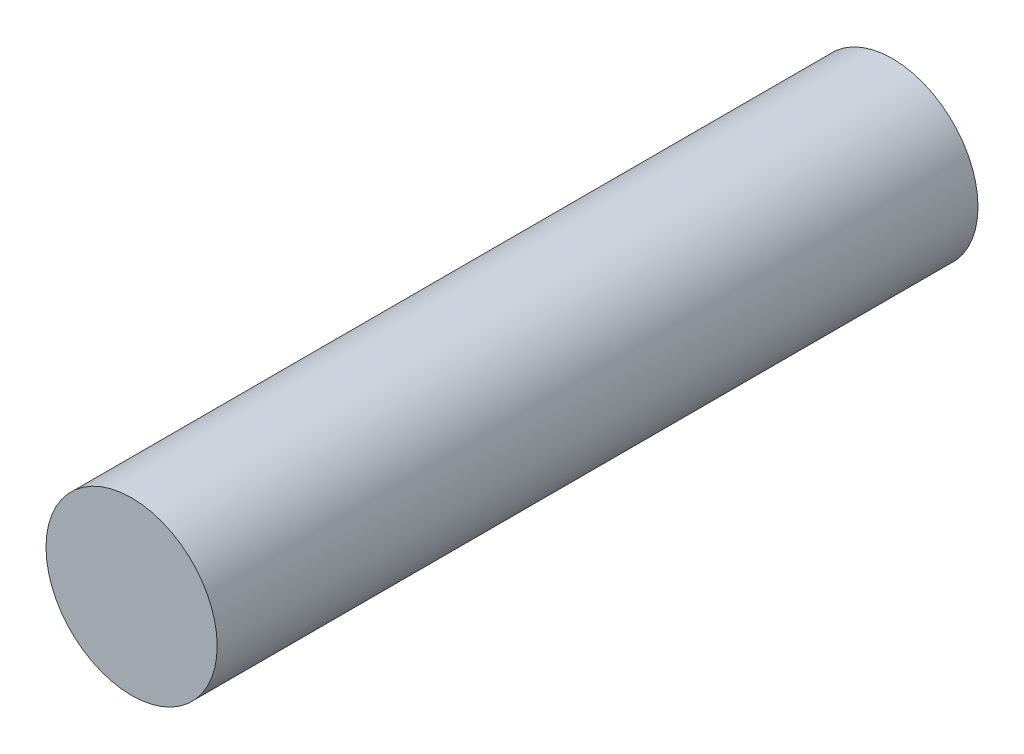
ISO-10303-21;
HEADER;
FILE_DESCRIPTION(('STEP AP214'),'2;1');
FILE_NAME('part.step','',(''),(''),'','','');
FILE_SCHEMA(('AUTOMOTIVE_DESIGN { 1 0 10303 214 1 1 1 1 }'));
ENDSEC;
DATA;
#1=APPLICATION_CONTEXT('core data for automotive mechanical design processes');
#2=APPLICATION_PROTOCOL_DEFINITION('international standard','automotive_design',2000,#1);
#3=PRODUCT_CONTEXT('',#1,'mechanical');
#4=PRODUCT('Part','Part','',(#3));
#5=PRODUCT_RELATED_PRODUCT_CATEGORY('part','',(#4));
#6=PRODUCT_DEFINITION_FORMATION('','',#4);
#7=PRODUCT_DEFINITION_CONTEXT('part definition',#1,'design');
#8=PRODUCT_DEFINITION('design','',#6,#7);
#9=PRODUCT_DEFINITION_SHAPE('','',#8);
#10=(LENGTH_UNIT() NAMED_UNIT(*) SI_UNIT(.MILLI.,.METRE.));
#11=(NAMED_UNIT(*) PLANE_ANGLE_UNIT() SI_UNIT($,.RADIAN.));
#12=(NAMED_UNIT(*) SI_UNIT($,.STERADIAN.) SOLID_ANGLE_UNIT());
#13=UNCERTAINTY_MEASURE_WITH_UNIT(LENGTH_MEASURE(1.E-05),#10,'distance_accuracy_value','');
#14=(GEOMETRIC_REPRESENTATION_CONTEXT(3) GLOBAL_UNCERTAINTY_ASSIGNED_CONTEXT((#13)) GLOBAL_UNIT_ASSIGNED_CONTEXT((#10,
#11,#12)) REPRESENTATION_CONTEXT('',''));
#15=CARTESIAN_POINT('',(0.,0.,0.));
#16=DIRECTION('',(0.,0.,1.));
#17=DIRECTION('',(1.,0.,0.));
#18=AXIS2_PLACEMENT_3D('',#15,#16,#17);
#19=CARTESIAN_POINT('',(-7.12999999999994,4.82999999999915,-8.));
#20=DIRECTION('',(0.,0.,1.));
#21=DIRECTION('',(1.,0.,0.));
#22=AXIS2_PLACEMENT_3D('',#19,#20,#21);
#23=CYLINDRICAL_SURFACE('',#22,0.9);
#24=CARTESIAN_POINT('',(-7.12999999999994,4.82999999999915,-8.));
#25=DIRECTION('',(0.,0.,1.));
#26=DIRECTION('',(1.,0.,0.));
#27=AXIS2_PLACEMENT_3D('',#24,#25,#26);
#28=CIRCLE('',#27,0.9);
#29=CARTESIAN_POINT('',(-6.22999999999994,4.82999999999915,-8.));
#30=VERTEX_POINT('',#29);
#31=EDGE_CURVE('E10',#30,#30,#28,.T.);
#32=ORIENTED_EDGE('',*,*,#31,.T.);
#33=EDGE_LOOP('',(#32));
#34=FACE_BOUND('',#33,.T.);
#35=CARTESIAN_POINT('',(-7.12999999999994,4.82999999999915,0.));
#36=DIRECTION('',(0.,0.,1.));
#37=DIRECTION('',(1.,0.,0.));
#38=AXIS2_PLACEMENT_3D('',#35,#36,#37);
#39=CIRCLE('',#38,0.9);
#40=CARTESIAN_POINT('',(-6.22999999999994,4.82999999999915,0.));
#41=VERTEX_POINT('',#40);
#42=EDGE_CURVE('E46',#41,#41,#39,.T.);
#43=ORIENTED_EDGE('',*,*,#42,.F.);
#44=EDGE_LOOP('',(#43));
#45=FACE_BOUND('',#44,.T.);
#46=ADVANCED_FACE('F43',(#34,#45),#23,.T.);
#47=CARTESIAN_POINT('',(-7.12999999999994,4.82999999999915,-8.));
#48=DIRECTION('',(0.,0.,1.));
#49=DIRECTION('',(1.,0.,0.));
#50=AXIS2_PLACEMENT_3D('',#47,#48,#49);
#51=PLANE('',#50);
#52=ORIENTED_EDGE('',*,*,#31,.F.);
#53=EDGE_LOOP('',(#52));
#54=FACE_BOUND('',#53,.T.);
#55=ADVANCED_FACE('F60',(#54),#51,.F.);
#56=CARTESIAN_POINT('',(-7.12999999999994,4.82999999999915,0.));
#57=DIRECTION('',(0.,0.,1.));
#58=DIRECTION('',(1.,0.,0.));
#59=AXIS2_PLACEMENT_3D('',#56,#57,#58);
#60=PLANE('',#59);
#61=ORIENTED_EDGE('',*,*,#42,.T.);
#62=EDGE_LOOP('',(#61));
#63=FACE_BOUND('',#62,.T.);
#64=ADVANCED_FACE('F57',(#63),#60,.T.);
#65=CLOSED_SHELL('',(#46,#55,#64));
#66=MANIFOLD_SOLID_BREP('B2',#65);
#67=ADVANCED_BREP_SHAPE_REPRESENTATION('',(#18,#66),#14);
#68=SHAPE_DEFINITION_REPRESENTATION(#9,#67);
ENDSEC;
END-ISO-10303-21;
